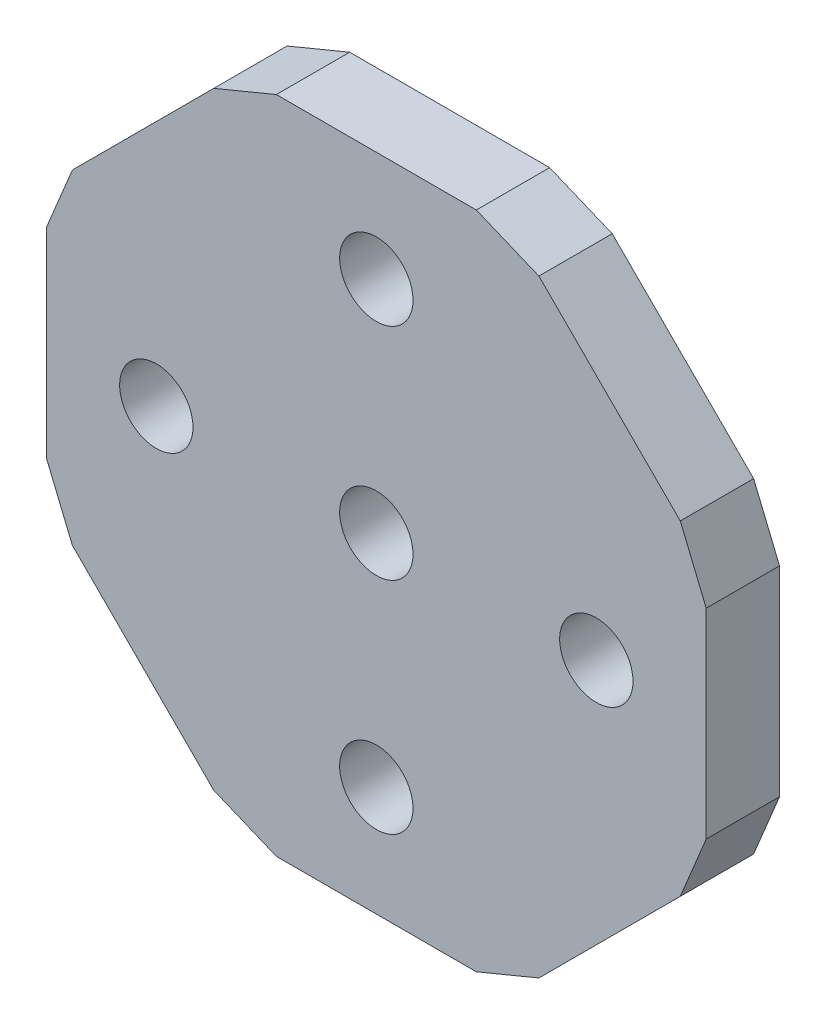
ISO-10303-21;
HEADER;
FILE_DESCRIPTION(('STEP AP214'),'2;1');
FILE_NAME('part.step','',(''),(''),'','','');
FILE_SCHEMA(('AUTOMOTIVE_DESIGN { 1 0 10303 214 1 1 1 1 }'));
ENDSEC;
DATA;
#1=APPLICATION_CONTEXT('core data for automotive mechanical design processes');
#2=APPLICATION_PROTOCOL_DEFINITION('international standard','automotive_design',2000,#1);
#3=PRODUCT_CONTEXT('',#1,'mechanical');
#4=PRODUCT('Part','Part','',(#3));
#5=PRODUCT_RELATED_PRODUCT_CATEGORY('part','',(#4));
#6=PRODUCT_DEFINITION_FORMATION('','',#4);
#7=PRODUCT_DEFINITION_CONTEXT('part definition',#1,'design');
#8=PRODUCT_DEFINITION('design','',#6,#7);
#9=PRODUCT_DEFINITION_SHAPE('','',#8);
#10=(LENGTH_UNIT() NAMED_UNIT(*) SI_UNIT(.MILLI.,.METRE.));
#11=(NAMED_UNIT(*) PLANE_ANGLE_UNIT() SI_UNIT($,.RADIAN.));
#12=(NAMED_UNIT(*) SI_UNIT($,.STERADIAN.) SOLID_ANGLE_UNIT());
#13=UNCERTAINTY_MEASURE_WITH_UNIT(LENGTH_MEASURE(1.E-05),#10,'distance_accuracy_value','');
#14=(GEOMETRIC_REPRESENTATION_CONTEXT(3) GLOBAL_UNCERTAINTY_ASSIGNED_CONTEXT((#13)) GLOBAL_UNIT_ASSIGNED_CONTEXT((#10,
#11,#12)) REPRESENTATION_CONTEXT('',''));
#15=CARTESIAN_POINT('',(0.,0.,0.));
#16=DIRECTION('',(0.,0.,1.));
#17=DIRECTION('',(1.,0.,0.));
#18=AXIS2_PLACEMENT_3D('',#15,#16,#17);
#19=CARTESIAN_POINT('',(0.,0.,3.));
#20=DIRECTION('',(0.,0.,1.));
#21=DIRECTION('',(1.,0.,0.));
#22=AXIS2_PLACEMENT_3D('',#19,#20,#21);
#23=PLANE('',#22);
#24=CARTESIAN_POINT('',(224.7478079135,241.9520199932,3.));
#25=DIRECTION('',(0.,0.,1.));
#26=DIRECTION('',(1.,0.,0.));
#27=AXIS2_PLACEMENT_3D('',#24,#25,#26);
#28=CIRCLE('',#27,1.5);
#29=CARTESIAN_POINT('',(226.2478079135,241.9520199932,3.));
#30=VERTEX_POINT('',#29);
#31=EDGE_CURVE('E348',#30,#30,#28,.T.);
#32=ORIENTED_EDGE('',*,*,#31,.F.);
#33=EDGE_LOOP('',(#32));
#34=FACE_BOUND('',#33,.T.);
#35=CARTESIAN_POINT('',(215.7478079135,232.9520199932,3.));
#36=DIRECTION('',(0.,0.,1.));
#37=DIRECTION('',(1.,0.,0.));
#38=AXIS2_PLACEMENT_3D('',#35,#36,#37);
#39=CIRCLE('',#38,1.5);
#40=CARTESIAN_POINT('',(217.2478079135,232.9520199932,3.));
#41=VERTEX_POINT('',#40);
#42=EDGE_CURVE('E360',#41,#41,#39,.T.);
#43=ORIENTED_EDGE('',*,*,#42,.F.);
#44=EDGE_LOOP('',(#43));
#45=FACE_BOUND('',#44,.T.);
#46=DIRECTION('',(0.923879532509778,0.382683432368732,0.));
#47=VECTOR('',#46,1.);
#48=CARTESIAN_POINT('',(222.3982801095,229.517680165,3.));
#49=LINE('',#48,#47);
#50=CARTESIAN_POINT('',(219.8376199377,228.4570199932,3.));
#51=VERTEX_POINT('',#50);
#52=CARTESIAN_POINT('',(222.3982801095,229.517680165,3.));
#53=VERTEX_POINT('',#52);
#54=EDGE_CURVE('E209',#51,#53,#49,.T.);
#55=ORIENTED_EDGE('',*,*,#54,.T.);
#56=DIRECTION('',(0.707106781186548,0.707106781186548,0.));
#57=VECTOR('',#56,1.);
#58=CARTESIAN_POINT('',(228.1821477417,235.3015477972,3.));
#59=LINE('',#58,#57);
#60=CARTESIAN_POINT('',(228.1821477417,235.3015477972,3.));
#61=VERTEX_POINT('',#60);
#62=EDGE_CURVE('E117',#53,#61,#59,.T.);
#63=ORIENTED_EDGE('',*,*,#62,.T.);
#64=DIRECTION('',(0.382683432368732,0.923879532509778,0.));
#65=VECTOR('',#64,1.);
#66=CARTESIAN_POINT('',(228.1821477417,235.3015477972,3.));
#67=LINE('',#66,#65);
#68=CARTESIAN_POINT('',(229.2428079135,237.862207969,3.));
#69=VERTEX_POINT('',#68);
#70=EDGE_CURVE('E248',#61,#69,#67,.T.);
#71=ORIENTED_EDGE('',*,*,#70,.T.);
#72=DIRECTION('',(0.,1.,0.));
#73=VECTOR('',#72,1.);
#74=CARTESIAN_POINT('',(229.2428079135,246.0418320174,3.));
#75=LINE('',#74,#73);
#76=CARTESIAN_POINT('',(229.2428079135,246.0418320174,3.));
#77=VERTEX_POINT('',#76);
#78=EDGE_CURVE('E267',#69,#77,#75,.T.);
#79=ORIENTED_EDGE('',*,*,#78,.T.);
#80=DIRECTION('',(-0.382683432368732,0.923879532509778,0.));
#81=VECTOR('',#80,1.);
#82=CARTESIAN_POINT('',(229.2428079135,246.0418320174,3.));
#83=LINE('',#82,#81);
#84=CARTESIAN_POINT('',(228.1821477417,248.6024921892,3.));
#85=VERTEX_POINT('',#84);
#86=EDGE_CURVE('E264',#77,#85,#83,.T.);
#87=ORIENTED_EDGE('',*,*,#86,.T.);
#88=DIRECTION('',(-0.707106781186548,0.707106781186548,0.));
#89=VECTOR('',#88,1.);
#90=CARTESIAN_POINT('',(222.3982801095,254.3863598214,3.));
#91=LINE('',#90,#89);
#92=CARTESIAN_POINT('',(222.3982801095,254.3863598214,3.));
#93=VERTEX_POINT('',#92);
#94=EDGE_CURVE('E266',#85,#93,#91,.T.);
#95=ORIENTED_EDGE('',*,*,#94,.T.);
#96=DIRECTION('',(-0.923879532509778,0.382683432368732,0.));
#97=VECTOR('',#96,1.);
#98=CARTESIAN_POINT('',(222.3982801095,254.3863598214,3.));
#99=LINE('',#98,#97);
#100=CARTESIAN_POINT('',(219.8376199377,255.4470199932,3.));
#101=VERTEX_POINT('',#100);
#102=EDGE_CURVE('E269',#93,#101,#99,.T.);
#103=ORIENTED_EDGE('',*,*,#102,.T.);
#104=DIRECTION('',(-1.,0.,0.));
#105=VECTOR('',#104,1.);
#106=CARTESIAN_POINT('',(211.6579958893,255.4470199932,3.));
#107=LINE('',#106,#105);
#108=CARTESIAN_POINT('',(211.6579958893,255.4470199932,3.));
#109=VERTEX_POINT('',#108);
#110=EDGE_CURVE('E275',#101,#109,#107,.T.);
#111=ORIENTED_EDGE('',*,*,#110,.T.);
#112=DIRECTION('',(-0.923879532509778,-0.382683432368732,0.));
#113=VECTOR('',#112,1.);
#114=CARTESIAN_POINT('',(211.6579958893,255.4470199932,3.));
#115=LINE('',#114,#113);
#116=CARTESIAN_POINT('',(209.0973357175,254.3863598214,3.));
#117=VERTEX_POINT('',#116);
#118=EDGE_CURVE('E277',#109,#117,#115,.T.);
#119=ORIENTED_EDGE('',*,*,#118,.T.);
#120=DIRECTION('',(-0.707106781186548,-0.707106781186548,0.));
#121=VECTOR('',#120,1.);
#122=CARTESIAN_POINT('',(203.3134680853,248.6024921892,3.));
#123=LINE('',#122,#121);
#124=CARTESIAN_POINT('',(203.3134680853,248.6024921892,3.));
#125=VERTEX_POINT('',#124);
#126=EDGE_CURVE('E279',#117,#125,#123,.T.);
#127=ORIENTED_EDGE('',*,*,#126,.T.);
#128=DIRECTION('',(-0.382683432368732,-0.923879532509778,0.));
#129=VECTOR('',#128,1.);
#130=CARTESIAN_POINT('',(202.2528079135,246.0418320174,3.));
#131=LINE('',#130,#129);
#132=CARTESIAN_POINT('',(202.2528079135,246.0418320174,3.));
#133=VERTEX_POINT('',#132);
#134=EDGE_CURVE('E281',#125,#133,#131,.T.);
#135=ORIENTED_EDGE('',*,*,#134,.T.);
#136=DIRECTION('',(0.,-1.,0.));
#137=VECTOR('',#136,1.);
#138=CARTESIAN_POINT('',(202.2528079135,237.862207969,3.));
#139=LINE('',#138,#137);
#140=CARTESIAN_POINT('',(202.2528079135,237.862207969,3.));
#141=VERTEX_POINT('',#140);
#142=EDGE_CURVE('E283',#133,#141,#139,.T.);
#143=ORIENTED_EDGE('',*,*,#142,.T.);
#144=DIRECTION('',(0.382683432368732,-0.923879532509778,0.));
#145=VECTOR('',#144,1.);
#146=CARTESIAN_POINT('',(202.2528079135,237.862207969,3.));
#147=LINE('',#146,#145);
#148=CARTESIAN_POINT('',(203.3134680853,235.3015477972,3.));
#149=VERTEX_POINT('',#148);
#150=EDGE_CURVE('E160',#141,#149,#147,.T.);
#151=ORIENTED_EDGE('',*,*,#150,.T.);
#152=DIRECTION('',(0.707106781186548,-0.707106781186548,0.));
#153=VECTOR('',#152,1.);
#154=CARTESIAN_POINT('',(209.0973357175,229.517680165,3.));
#155=LINE('',#154,#153);
#156=CARTESIAN_POINT('',(209.0973357175,229.517680165,3.));
#157=VERTEX_POINT('',#156);
#158=EDGE_CURVE('E154',#149,#157,#155,.T.);
#159=ORIENTED_EDGE('',*,*,#158,.T.);
#160=DIRECTION('',(0.923879532509778,-0.382683432368732,0.));
#161=VECTOR('',#160,1.);
#162=CARTESIAN_POINT('',(209.0973357175,229.517680165,3.));
#163=LINE('',#162,#161);
#164=CARTESIAN_POINT('',(211.6579958893,228.4570199932,3.));
#165=VERTEX_POINT('',#164);
#166=EDGE_CURVE('E158',#157,#165,#163,.T.);
#167=ORIENTED_EDGE('',*,*,#166,.T.);
#168=DIRECTION('',(1.,0.,0.));
#169=VECTOR('',#168,1.);
#170=CARTESIAN_POINT('',(219.8376199377,228.4570199932,3.));
#171=LINE('',#170,#169);
#172=EDGE_CURVE('E50',#165,#51,#171,.T.);
#173=ORIENTED_EDGE('',*,*,#172,.T.);
#174=EDGE_LOOP('',(#55,#63,#71,#79,#87,#95,#103,#111,#119,#127,#135,#143,#151,#159,#167,#173));
#175=FACE_BOUND('',#174,.T.);
#176=CARTESIAN_POINT('',(215.7478079135,241.9520199932,3.));
#177=DIRECTION('',(0.,0.,1.));
#178=DIRECTION('',(1.,0.,0.));
#179=AXIS2_PLACEMENT_3D('',#176,#177,#178);
#180=CIRCLE('',#179,1.5);
#181=CARTESIAN_POINT('',(217.2478079135,241.9520199932,3.));
#182=VERTEX_POINT('',#181);
#183=EDGE_CURVE('E182',#182,#182,#180,.T.);
#184=ORIENTED_EDGE('',*,*,#183,.F.);
#185=EDGE_LOOP('',(#184));
#186=FACE_BOUND('',#185,.T.);
#187=CARTESIAN_POINT('',(215.7478079135,250.9520199932,3.));
#188=DIRECTION('',(0.,0.,1.));
#189=DIRECTION('',(1.,0.,0.));
#190=AXIS2_PLACEMENT_3D('',#187,#188,#189);
#191=CIRCLE('',#190,1.5);
#192=CARTESIAN_POINT('',(217.2478079135,250.9520199932,3.));
#193=VERTEX_POINT('',#192);
#194=EDGE_CURVE('E354',#193,#193,#191,.T.);
#195=ORIENTED_EDGE('',*,*,#194,.F.);
#196=EDGE_LOOP('',(#195));
#197=FACE_BOUND('',#196,.T.);
#198=CARTESIAN_POINT('',(206.7478079135,241.9520199932,3.));
#199=DIRECTION('',(0.,0.,1.));
#200=DIRECTION('',(1.,0.,0.));
#201=AXIS2_PLACEMENT_3D('',#198,#199,#200);
#202=CIRCLE('',#201,1.5);
#203=CARTESIAN_POINT('',(208.2478079135,241.9520199932,3.));
#204=VERTEX_POINT('',#203);
#205=EDGE_CURVE('E339',#204,#204,#202,.T.);
#206=ORIENTED_EDGE('',*,*,#205,.F.);
#207=EDGE_LOOP('',(#206));
#208=FACE_BOUND('',#207,.T.);
#209=ADVANCED_FACE('F33',(#34,#45,#175,#186,#197,#208),#23,.T.);
#210=CARTESIAN_POINT('',(0.,0.,0.));
#211=DIRECTION('',(0.,0.,1.));
#212=DIRECTION('',(1.,0.,0.));
#213=AXIS2_PLACEMENT_3D('',#210,#211,#212);
#214=PLANE('',#213);
#215=CARTESIAN_POINT('',(224.7478079135,241.9520199932,0.));
#216=DIRECTION('',(0.,0.,1.));
#217=DIRECTION('',(1.,0.,0.));
#218=AXIS2_PLACEMENT_3D('',#215,#216,#217);
#219=CIRCLE('',#218,1.5);
#220=CARTESIAN_POINT('',(226.2478079135,241.9520199932,0.));
#221=VERTEX_POINT('',#220);
#222=EDGE_CURVE('E345',#221,#221,#219,.T.);
#223=ORIENTED_EDGE('',*,*,#222,.T.);
#224=EDGE_LOOP('',(#223));
#225=FACE_BOUND('',#224,.T.);
#226=CARTESIAN_POINT('',(215.7478079135,232.9520199932,0.));
#227=DIRECTION('',(0.,0.,1.));
#228=DIRECTION('',(1.,0.,0.));
#229=AXIS2_PLACEMENT_3D('',#226,#227,#228);
#230=CIRCLE('',#229,1.5);
#231=CARTESIAN_POINT('',(217.2478079135,232.9520199932,0.));
#232=VERTEX_POINT('',#231);
#233=EDGE_CURVE('E357',#232,#232,#230,.T.);
#234=ORIENTED_EDGE('',*,*,#233,.T.);
#235=EDGE_LOOP('',(#234));
#236=FACE_BOUND('',#235,.T.);
#237=DIRECTION('',(0.923879532509778,0.382683432368732,0.));
#238=VECTOR('',#237,1.);
#239=CARTESIAN_POINT('',(222.3982801095,229.517680165,0.));
#240=LINE('',#239,#238);
#241=CARTESIAN_POINT('',(219.8376199377,228.4570199932,0.));
#242=VERTEX_POINT('',#241);
#243=CARTESIAN_POINT('',(222.3982801095,229.517680165,0.));
#244=VERTEX_POINT('',#243);
#245=EDGE_CURVE('E178',#242,#244,#240,.T.);
#246=ORIENTED_EDGE('',*,*,#245,.F.);
#247=DIRECTION('',(1.,0.,0.));
#248=VECTOR('',#247,1.);
#249=CARTESIAN_POINT('',(219.8376199377,228.4570199932,0.));
#250=LINE('',#249,#248);
#251=CARTESIAN_POINT('',(211.6579958893,228.4570199932,0.));
#252=VERTEX_POINT('',#251);
#253=EDGE_CURVE('E109',#252,#242,#250,.T.);
#254=ORIENTED_EDGE('',*,*,#253,.F.);
#255=DIRECTION('',(0.923879532509778,-0.382683432368732,0.));
#256=VECTOR('',#255,1.);
#257=CARTESIAN_POINT('',(209.0973357175,229.517680165,0.));
#258=LINE('',#257,#256);
#259=CARTESIAN_POINT('',(209.0973357175,229.517680165,0.));
#260=VERTEX_POINT('',#259);
#261=EDGE_CURVE('E103',#260,#252,#258,.T.);
#262=ORIENTED_EDGE('',*,*,#261,.F.);
#263=DIRECTION('',(0.707106781186548,-0.707106781186548,0.));
#264=VECTOR('',#263,1.);
#265=CARTESIAN_POINT('',(209.0973357175,229.517680165,0.));
#266=LINE('',#265,#264);
#267=CARTESIAN_POINT('',(203.3134680853,235.3015477972,0.));
#268=VERTEX_POINT('',#267);
#269=EDGE_CURVE('E168',#268,#260,#266,.T.);
#270=ORIENTED_EDGE('',*,*,#269,.F.);
#271=DIRECTION('',(0.382683432368732,-0.923879532509778,0.));
#272=VECTOR('',#271,1.);
#273=CARTESIAN_POINT('',(202.2528079135,237.862207969,0.));
#274=LINE('',#273,#272);
#275=CARTESIAN_POINT('',(202.2528079135,237.862207969,0.));
#276=VERTEX_POINT('',#275);
#277=EDGE_CURVE('E204',#276,#268,#274,.T.);
#278=ORIENTED_EDGE('',*,*,#277,.F.);
#279=DIRECTION('',(0.,-1.,0.));
#280=VECTOR('',#279,1.);
#281=CARTESIAN_POINT('',(202.2528079135,237.862207969,0.));
#282=LINE('',#281,#280);
#283=CARTESIAN_POINT('',(202.2528079135,246.0418320174,0.));
#284=VERTEX_POINT('',#283);
#285=EDGE_CURVE('E202',#284,#276,#282,.T.);
#286=ORIENTED_EDGE('',*,*,#285,.F.);
#287=DIRECTION('',(-0.382683432368732,-0.923879532509778,0.));
#288=VECTOR('',#287,1.);
#289=CARTESIAN_POINT('',(202.2528079135,246.0418320174,0.));
#290=LINE('',#289,#288);
#291=CARTESIAN_POINT('',(203.3134680853,248.6024921892,0.));
#292=VERTEX_POINT('',#291);
#293=EDGE_CURVE('E200',#292,#284,#290,.T.);
#294=ORIENTED_EDGE('',*,*,#293,.F.);
#295=DIRECTION('',(-0.707106781186548,-0.707106781186548,0.));
#296=VECTOR('',#295,1.);
#297=CARTESIAN_POINT('',(203.3134680853,248.6024921892,0.));
#298=LINE('',#297,#296);
#299=CARTESIAN_POINT('',(209.0973357175,254.3863598214,0.));
#300=VERTEX_POINT('',#299);
#301=EDGE_CURVE('E198',#300,#292,#298,.T.);
#302=ORIENTED_EDGE('',*,*,#301,.F.);
#303=DIRECTION('',(-0.923879532509778,-0.382683432368732,0.));
#304=VECTOR('',#303,1.);
#305=CARTESIAN_POINT('',(211.6579958893,255.4470199932,0.));
#306=LINE('',#305,#304);
#307=CARTESIAN_POINT('',(211.6579958893,255.4470199932,0.));
#308=VERTEX_POINT('',#307);
#309=EDGE_CURVE('E196',#308,#300,#306,.T.);
#310=ORIENTED_EDGE('',*,*,#309,.F.);
#311=DIRECTION('',(-1.,0.,0.));
#312=VECTOR('',#311,1.);
#313=CARTESIAN_POINT('',(211.6579958893,255.4470199932,0.));
#314=LINE('',#313,#312);
#315=CARTESIAN_POINT('',(219.8376199377,255.4470199932,0.));
#316=VERTEX_POINT('',#315);
#317=EDGE_CURVE('E194',#316,#308,#314,.T.);
#318=ORIENTED_EDGE('',*,*,#317,.F.);
#319=DIRECTION('',(-0.923879532509778,0.382683432368732,0.));
#320=VECTOR('',#319,1.);
#321=CARTESIAN_POINT('',(222.3982801095,254.3863598214,0.));
#322=LINE('',#321,#320);
#323=CARTESIAN_POINT('',(222.3982801095,254.3863598214,0.));
#324=VERTEX_POINT('',#323);
#325=EDGE_CURVE('E192',#324,#316,#322,.T.);
#326=ORIENTED_EDGE('',*,*,#325,.F.);
#327=DIRECTION('',(-0.707106781186548,0.707106781186548,0.));
#328=VECTOR('',#327,1.);
#329=CARTESIAN_POINT('',(222.3982801095,254.3863598214,0.));
#330=LINE('',#329,#328);
#331=CARTESIAN_POINT('',(228.1821477417,248.6024921892,0.));
#332=VERTEX_POINT('',#331);
#333=EDGE_CURVE('E190',#332,#324,#330,.T.);
#334=ORIENTED_EDGE('',*,*,#333,.F.);
#335=DIRECTION('',(-0.382683432368732,0.923879532509778,0.));
#336=VECTOR('',#335,1.);
#337=CARTESIAN_POINT('',(229.2428079135,246.0418320174,0.));
#338=LINE('',#337,#336);
#339=CARTESIAN_POINT('',(229.2428079135,246.0418320174,0.));
#340=VERTEX_POINT('',#339);
#341=EDGE_CURVE('E188',#340,#332,#338,.T.);
#342=ORIENTED_EDGE('',*,*,#341,.F.);
#343=DIRECTION('',(0.,1.,0.));
#344=VECTOR('',#343,1.);
#345=CARTESIAN_POINT('',(229.2428079135,246.0418320174,0.));
#346=LINE('',#345,#344);
#347=CARTESIAN_POINT('',(229.2428079135,237.862207969,0.));
#348=VERTEX_POINT('',#347);
#349=EDGE_CURVE('E186',#348,#340,#346,.T.);
#350=ORIENTED_EDGE('',*,*,#349,.F.);
#351=DIRECTION('',(0.382683432368732,0.923879532509778,0.));
#352=VECTOR('',#351,1.);
#353=CARTESIAN_POINT('',(228.1821477417,235.3015477972,0.));
#354=LINE('',#353,#352);
#355=CARTESIAN_POINT('',(228.1821477417,235.3015477972,0.));
#356=VERTEX_POINT('',#355);
#357=EDGE_CURVE('E184',#356,#348,#354,.T.);
#358=ORIENTED_EDGE('',*,*,#357,.F.);
#359=DIRECTION('',(0.707106781186548,0.707106781186548,0.));
#360=VECTOR('',#359,1.);
#361=CARTESIAN_POINT('',(228.1821477417,235.3015477972,0.));
#362=LINE('',#361,#360);
#363=EDGE_CURVE('E181',#244,#356,#362,.T.);
#364=ORIENTED_EDGE('',*,*,#363,.F.);
#365=EDGE_LOOP('',(#246,#254,#262,#270,#278,#286,#294,#302,#310,#318,#326,#334,#342,#350,#358,#364));
#366=FACE_BOUND('',#365,.T.);
#367=CARTESIAN_POINT('',(215.7478079135,241.9520199932,0.));
#368=DIRECTION('',(0.,0.,1.));
#369=DIRECTION('',(1.,0.,0.));
#370=AXIS2_PLACEMENT_3D('',#367,#368,#369);
#371=CIRCLE('',#370,1.5);
#372=CARTESIAN_POINT('',(217.2478079135,241.9520199932,0.));
#373=VERTEX_POINT('',#372);
#374=EDGE_CURVE('E363',#373,#373,#371,.T.);
#375=ORIENTED_EDGE('',*,*,#374,.T.);
#376=EDGE_LOOP('',(#375));
#377=FACE_BOUND('',#376,.T.);
#378=CARTESIAN_POINT('',(215.7478079135,250.9520199932,0.));
#379=DIRECTION('',(0.,0.,1.));
#380=DIRECTION('',(1.,0.,0.));
#381=AXIS2_PLACEMENT_3D('',#378,#379,#380);
#382=CIRCLE('',#381,1.5);
#383=CARTESIAN_POINT('',(217.2478079135,250.9520199932,0.));
#384=VERTEX_POINT('',#383);
#385=EDGE_CURVE('E351',#384,#384,#382,.T.);
#386=ORIENTED_EDGE('',*,*,#385,.T.);
#387=EDGE_LOOP('',(#386));
#388=FACE_BOUND('',#387,.T.);
#389=CARTESIAN_POINT('',(206.7478079135,241.9520199932,0.));
#390=DIRECTION('',(0.,0.,1.));
#391=DIRECTION('',(1.,0.,0.));
#392=AXIS2_PLACEMENT_3D('',#389,#390,#391);
#393=CIRCLE('',#392,1.5);
#394=CARTESIAN_POINT('',(208.2478079135,241.9520199932,0.));
#395=VERTEX_POINT('',#394);
#396=EDGE_CURVE('E342',#395,#395,#393,.T.);
#397=ORIENTED_EDGE('',*,*,#396,.T.);
#398=EDGE_LOOP('',(#397));
#399=FACE_BOUND('',#398,.T.);
#400=ADVANCED_FACE('F252',(#225,#236,#366,#377,#388,#399),#214,.F.);
#401=CARTESIAN_POINT('',(222.3982801095,229.517680165,3.));
#402=DIRECTION('',(-0.382683432368732,0.923879532509778,0.));
#403=DIRECTION('',(-0.923879532509778,-0.382683432368732,0.));
#404=AXIS2_PLACEMENT_3D('',#401,#402,#403);
#405=PLANE('',#404);
#406=ORIENTED_EDGE('',*,*,#245,.T.);
#407=DIRECTION('',(0.,0.,-1.));
#408=VECTOR('',#407,1.);
#409=CARTESIAN_POINT('',(222.3982801095,229.517680165,3.));
#410=LINE('',#409,#408);
#411=EDGE_CURVE('E11',#53,#244,#410,.T.);
#412=ORIENTED_EDGE('',*,*,#411,.F.);
#413=ORIENTED_EDGE('',*,*,#54,.F.);
#414=DIRECTION('',(0.,0.,-1.));
#415=VECTOR('',#414,1.);
#416=CARTESIAN_POINT('',(219.8376199377,228.4570199932,3.));
#417=LINE('',#416,#415);
#418=EDGE_CURVE('E174',#51,#242,#417,.T.);
#419=ORIENTED_EDGE('',*,*,#418,.T.);
#420=EDGE_LOOP('',(#406,#412,#413,#419));
#421=FACE_BOUND('',#420,.T.);
#422=ADVANCED_FACE('F35',(#421),#405,.F.);
#423=CARTESIAN_POINT('',(228.1821477417,235.3015477972,3.));
#424=DIRECTION('',(-0.707106781186547,0.707106781186547,0.));
#425=DIRECTION('',(-0.707106781186548,-0.707106781186548,0.));
#426=AXIS2_PLACEMENT_3D('',#423,#424,#425);
#427=PLANE('',#426);
#428=ORIENTED_EDGE('',*,*,#363,.T.);
#429=DIRECTION('',(0.,0.,-1.));
#430=VECTOR('',#429,1.);
#431=CARTESIAN_POINT('',(228.1821477417,235.3015477972,3.));
#432=LINE('',#431,#430);
#433=EDGE_CURVE('E42',#61,#356,#432,.T.);
#434=ORIENTED_EDGE('',*,*,#433,.F.);
#435=ORIENTED_EDGE('',*,*,#62,.F.);
#436=ORIENTED_EDGE('',*,*,#411,.T.);
#437=EDGE_LOOP('',(#428,#434,#435,#436));
#438=FACE_BOUND('',#437,.T.);
#439=ADVANCED_FACE('F521',(#438),#427,.F.);
#440=CARTESIAN_POINT('',(228.1821477417,235.3015477972,3.));
#441=DIRECTION('',(-0.923879532509778,0.382683432368732,0.));
#442=DIRECTION('',(-0.382683432368732,-0.923879532509778,0.));
#443=AXIS2_PLACEMENT_3D('',#440,#441,#442);
#444=PLANE('',#443);
#445=ORIENTED_EDGE('',*,*,#357,.T.);
#446=DIRECTION('',(0.,0.,-1.));
#447=VECTOR('',#446,1.);
#448=CARTESIAN_POINT('',(229.2428079135,237.862207969,3.));
#449=LINE('',#448,#447);
#450=EDGE_CURVE('E240',#69,#348,#449,.T.);
#451=ORIENTED_EDGE('',*,*,#450,.F.);
#452=ORIENTED_EDGE('',*,*,#70,.F.);
#453=ORIENTED_EDGE('',*,*,#433,.T.);
#454=EDGE_LOOP('',(#445,#451,#452,#453));
#455=FACE_BOUND('',#454,.T.);
#456=ADVANCED_FACE('F246',(#455),#444,.F.);
#457=CARTESIAN_POINT('',(229.2428079135,246.0418320174,3.));
#458=DIRECTION('',(-1.,0.,0.));
#459=DIRECTION('',(0.,0.,1.));
#460=AXIS2_PLACEMENT_3D('',#457,#458,#459);
#461=PLANE('',#460);
#462=ORIENTED_EDGE('',*,*,#349,.T.);
#463=DIRECTION('',(0.,0.,-1.));
#464=VECTOR('',#463,1.);
#465=CARTESIAN_POINT('',(229.2428079135,246.0418320174,3.));
#466=LINE('',#465,#464);
#467=EDGE_CURVE('E237',#77,#340,#466,.T.);
#468=ORIENTED_EDGE('',*,*,#467,.F.);
#469=ORIENTED_EDGE('',*,*,#78,.F.);
#470=ORIENTED_EDGE('',*,*,#450,.T.);
#471=EDGE_LOOP('',(#462,#468,#469,#470));
#472=FACE_BOUND('',#471,.T.);
#473=ADVANCED_FACE('F258',(#472),#461,.F.);
#474=CARTESIAN_POINT('',(229.2428079135,246.0418320174,3.));
#475=DIRECTION('',(-0.923879532509778,-0.382683432368732,0.));
#476=DIRECTION('',(0.382683432368732,-0.923879532509778,0.));
#477=AXIS2_PLACEMENT_3D('',#474,#475,#476);
#478=PLANE('',#477);
#479=ORIENTED_EDGE('',*,*,#341,.T.);
#480=DIRECTION('',(0.,0.,-1.));
#481=VECTOR('',#480,1.);
#482=CARTESIAN_POINT('',(228.1821477417,248.6024921892,3.));
#483=LINE('',#482,#481);
#484=EDGE_CURVE('E234',#85,#332,#483,.T.);
#485=ORIENTED_EDGE('',*,*,#484,.F.);
#486=ORIENTED_EDGE('',*,*,#86,.F.);
#487=ORIENTED_EDGE('',*,*,#467,.T.);
#488=EDGE_LOOP('',(#479,#485,#486,#487));
#489=FACE_BOUND('',#488,.T.);
#490=ADVANCED_FACE('F262',(#489),#478,.F.);
#491=CARTESIAN_POINT('',(222.3982801095,254.3863598214,3.));
#492=DIRECTION('',(-0.707106781186547,-0.707106781186547,0.));
#493=DIRECTION('',(0.707106781186548,-0.707106781186548,0.));
#494=AXIS2_PLACEMENT_3D('',#491,#492,#493);
#495=PLANE('',#494);
#496=ORIENTED_EDGE('',*,*,#333,.T.);
#497=DIRECTION('',(0.,0.,-1.));
#498=VECTOR('',#497,1.);
#499=CARTESIAN_POINT('',(222.3982801095,254.3863598214,3.));
#500=LINE('',#499,#498);
#501=EDGE_CURVE('E231',#93,#324,#500,.T.);
#502=ORIENTED_EDGE('',*,*,#501,.F.);
#503=ORIENTED_EDGE('',*,*,#94,.F.);
#504=ORIENTED_EDGE('',*,*,#484,.T.);
#505=EDGE_LOOP('',(#496,#502,#503,#504));
#506=FACE_BOUND('',#505,.T.);
#507=ADVANCED_FACE('F486',(#506),#495,.F.);
#508=CARTESIAN_POINT('',(222.3982801095,254.3863598214,3.));
#509=DIRECTION('',(-0.382683432368732,-0.923879532509778,0.));
#510=DIRECTION('',(0.923879532509778,-0.382683432368732,0.));
#511=AXIS2_PLACEMENT_3D('',#508,#509,#510);
#512=PLANE('',#511);
#513=ORIENTED_EDGE('',*,*,#325,.T.);
#514=DIRECTION('',(0.,0.,-1.));
#515=VECTOR('',#514,1.);
#516=CARTESIAN_POINT('',(219.8376199377,255.4470199932,3.));
#517=LINE('',#516,#515);
#518=EDGE_CURVE('E228',#101,#316,#517,.T.);
#519=ORIENTED_EDGE('',*,*,#518,.F.);
#520=ORIENTED_EDGE('',*,*,#102,.F.);
#521=ORIENTED_EDGE('',*,*,#501,.T.);
#522=EDGE_LOOP('',(#513,#519,#520,#521));
#523=FACE_BOUND('',#522,.T.);
#524=ADVANCED_FACE('F476',(#523),#512,.F.);
#525=CARTESIAN_POINT('',(211.6579958893,255.4470199932,3.));
#526=DIRECTION('',(0.,-1.,0.));
#527=DIRECTION('',(0.,0.,-1.));
#528=AXIS2_PLACEMENT_3D('',#525,#526,#527);
#529=PLANE('',#528);
#530=ORIENTED_EDGE('',*,*,#317,.T.);
#531=DIRECTION('',(0.,0.,-1.));
#532=VECTOR('',#531,1.);
#533=CARTESIAN_POINT('',(211.6579958893,255.4470199932,3.));
#534=LINE('',#533,#532);
#535=EDGE_CURVE('E225',#109,#308,#534,.T.);
#536=ORIENTED_EDGE('',*,*,#535,.F.);
#537=ORIENTED_EDGE('',*,*,#110,.F.);
#538=ORIENTED_EDGE('',*,*,#518,.T.);
#539=EDGE_LOOP('',(#530,#536,#537,#538));
#540=FACE_BOUND('',#539,.T.);
#541=ADVANCED_FACE('F466',(#540),#529,.F.);
#542=CARTESIAN_POINT('',(211.6579958893,255.4470199932,3.));
#543=DIRECTION('',(0.382683432368732,-0.923879532509778,0.));
#544=DIRECTION('',(0.923879532509778,0.382683432368732,0.));
#545=AXIS2_PLACEMENT_3D('',#542,#543,#544);
#546=PLANE('',#545);
#547=ORIENTED_EDGE('',*,*,#309,.T.);
#548=DIRECTION('',(0.,0.,-1.));
#549=VECTOR('',#548,1.);
#550=CARTESIAN_POINT('',(209.0973357175,254.3863598214,3.));
#551=LINE('',#550,#549);
#552=EDGE_CURVE('E222',#117,#300,#551,.T.);
#553=ORIENTED_EDGE('',*,*,#552,.F.);
#554=ORIENTED_EDGE('',*,*,#118,.F.);
#555=ORIENTED_EDGE('',*,*,#535,.T.);
#556=EDGE_LOOP('',(#547,#553,#554,#555));
#557=FACE_BOUND('',#556,.T.);
#558=ADVANCED_FACE('F456',(#557),#546,.F.);
#559=CARTESIAN_POINT('',(203.3134680853,248.6024921892,3.));
#560=DIRECTION('',(0.707106781186547,-0.707106781186547,0.));
#561=DIRECTION('',(0.707106781186548,0.707106781186548,0.));
#562=AXIS2_PLACEMENT_3D('',#559,#560,#561);
#563=PLANE('',#562);
#564=ORIENTED_EDGE('',*,*,#301,.T.);
#565=DIRECTION('',(0.,0.,-1.));
#566=VECTOR('',#565,1.);
#567=CARTESIAN_POINT('',(203.3134680853,248.6024921892,3.));
#568=LINE('',#567,#566);
#569=EDGE_CURVE('E219',#125,#292,#568,.T.);
#570=ORIENTED_EDGE('',*,*,#569,.F.);
#571=ORIENTED_EDGE('',*,*,#126,.F.);
#572=ORIENTED_EDGE('',*,*,#552,.T.);
#573=EDGE_LOOP('',(#564,#570,#571,#572));
#574=FACE_BOUND('',#573,.T.);
#575=ADVANCED_FACE('F446',(#574),#563,.F.);
#576=CARTESIAN_POINT('',(202.2528079135,246.0418320174,3.));
#577=DIRECTION('',(0.923879532509778,-0.382683432368732,0.));
#578=DIRECTION('',(0.382683432368732,0.923879532509778,0.));
#579=AXIS2_PLACEMENT_3D('',#576,#577,#578);
#580=PLANE('',#579);
#581=ORIENTED_EDGE('',*,*,#293,.T.);
#582=DIRECTION('',(0.,0.,-1.));
#583=VECTOR('',#582,1.);
#584=CARTESIAN_POINT('',(202.2528079135,246.0418320174,3.));
#585=LINE('',#584,#583);
#586=EDGE_CURVE('E216',#133,#284,#585,.T.);
#587=ORIENTED_EDGE('',*,*,#586,.F.);
#588=ORIENTED_EDGE('',*,*,#134,.F.);
#589=ORIENTED_EDGE('',*,*,#569,.T.);
#590=EDGE_LOOP('',(#581,#587,#588,#589));
#591=FACE_BOUND('',#590,.T.);
#592=ADVANCED_FACE('F437',(#591),#580,.F.);
#593=CARTESIAN_POINT('',(202.2528079135,237.862207969,3.));
#594=DIRECTION('',(1.,0.,0.));
#595=DIRECTION('',(0.,0.,-1.));
#596=AXIS2_PLACEMENT_3D('',#593,#594,#595);
#597=PLANE('',#596);
#598=ORIENTED_EDGE('',*,*,#285,.T.);
#599=DIRECTION('',(0.,0.,-1.));
#600=VECTOR('',#599,1.);
#601=CARTESIAN_POINT('',(202.2528079135,237.862207969,3.));
#602=LINE('',#601,#600);
#603=EDGE_CURVE('E213',#141,#276,#602,.T.);
#604=ORIENTED_EDGE('',*,*,#603,.F.);
#605=ORIENTED_EDGE('',*,*,#142,.F.);
#606=ORIENTED_EDGE('',*,*,#586,.T.);
#607=EDGE_LOOP('',(#598,#604,#605,#606));
#608=FACE_BOUND('',#607,.T.);
#609=ADVANCED_FACE('F289',(#608),#597,.F.);
#610=CARTESIAN_POINT('',(202.2528079135,237.862207969,3.));
#611=DIRECTION('',(0.923879532509778,0.382683432368732,0.));
#612=DIRECTION('',(-0.382683432368732,0.923879532509778,0.));
#613=AXIS2_PLACEMENT_3D('',#610,#611,#612);
#614=PLANE('',#613);
#615=ORIENTED_EDGE('',*,*,#277,.T.);
#616=DIRECTION('',(0.,0.,-1.));
#617=VECTOR('',#616,1.);
#618=CARTESIAN_POINT('',(203.3134680853,235.3015477972,3.));
#619=LINE('',#618,#617);
#620=EDGE_CURVE('E169',#149,#268,#619,.T.);
#621=ORIENTED_EDGE('',*,*,#620,.F.);
#622=ORIENTED_EDGE('',*,*,#150,.F.);
#623=ORIENTED_EDGE('',*,*,#603,.T.);
#624=EDGE_LOOP('',(#615,#621,#622,#623));
#625=FACE_BOUND('',#624,.T.);
#626=ADVANCED_FACE('F293',(#625),#614,.F.);
#627=CARTESIAN_POINT('',(209.0973357175,229.517680165,3.));
#628=DIRECTION('',(0.707106781186547,0.707106781186547,0.));
#629=DIRECTION('',(-0.707106781186548,0.707106781186548,0.));
#630=AXIS2_PLACEMENT_3D('',#627,#628,#629);
#631=PLANE('',#630);
#632=ORIENTED_EDGE('',*,*,#269,.T.);
#633=DIRECTION('',(0.,0.,-1.));
#634=VECTOR('',#633,1.);
#635=CARTESIAN_POINT('',(209.0973357175,229.517680165,3.));
#636=LINE('',#635,#634);
#637=EDGE_CURVE('E165',#157,#260,#636,.T.);
#638=ORIENTED_EDGE('',*,*,#637,.F.);
#639=ORIENTED_EDGE('',*,*,#158,.F.);
#640=ORIENTED_EDGE('',*,*,#620,.T.);
#641=EDGE_LOOP('',(#632,#638,#639,#640));
#642=FACE_BOUND('',#641,.T.);
#643=ADVANCED_FACE('F166',(#642),#631,.F.);
#644=CARTESIAN_POINT('',(209.0973357175,229.517680165,3.));
#645=DIRECTION('',(0.382683432368732,0.923879532509778,0.));
#646=DIRECTION('',(-0.923879532509778,0.382683432368732,0.));
#647=AXIS2_PLACEMENT_3D('',#644,#645,#646);
#648=PLANE('',#647);
#649=ORIENTED_EDGE('',*,*,#261,.T.);
#650=DIRECTION('',(0.,0.,-1.));
#651=VECTOR('',#650,1.);
#652=CARTESIAN_POINT('',(211.6579958893,228.4570199932,3.));
#653=LINE('',#652,#651);
#654=EDGE_CURVE('E170',#165,#252,#653,.T.);
#655=ORIENTED_EDGE('',*,*,#654,.F.);
#656=ORIENTED_EDGE('',*,*,#166,.F.);
#657=ORIENTED_EDGE('',*,*,#637,.T.);
#658=EDGE_LOOP('',(#649,#655,#656,#657));
#659=FACE_BOUND('',#658,.T.);
#660=ADVANCED_FACE('F172',(#659),#648,.F.);
#661=CARTESIAN_POINT('',(219.8376199377,228.4570199932,3.));
#662=DIRECTION('',(0.,1.,0.));
#663=DIRECTION('',(0.,0.,1.));
#664=AXIS2_PLACEMENT_3D('',#661,#662,#663);
#665=PLANE('',#664);
#666=ORIENTED_EDGE('',*,*,#253,.T.);
#667=ORIENTED_EDGE('',*,*,#418,.F.);
#668=ORIENTED_EDGE('',*,*,#172,.F.);
#669=ORIENTED_EDGE('',*,*,#654,.T.);
#670=EDGE_LOOP('',(#666,#667,#668,#669));
#671=FACE_BOUND('',#670,.T.);
#672=ADVANCED_FACE('F297',(#671),#665,.F.);
#673=CARTESIAN_POINT('',(215.7478079135,241.9520199932,3.));
#674=DIRECTION('',(0.,0.,-1.));
#675=DIRECTION('',(-1.,0.,0.));
#676=AXIS2_PLACEMENT_3D('',#673,#674,#675);
#677=CYLINDRICAL_SURFACE('',#676,1.5);
#678=ORIENTED_EDGE('',*,*,#183,.T.);
#679=EDGE_LOOP('',(#678));
#680=FACE_BOUND('',#679,.T.);
#681=ORIENTED_EDGE('',*,*,#374,.F.);
#682=EDGE_LOOP('',(#681));
#683=FACE_BOUND('',#682,.T.);
#684=ADVANCED_FACE('F299',(#680,#683),#677,.F.);
#685=CARTESIAN_POINT('',(215.7478079135,232.9520199932,3.));
#686=DIRECTION('',(0.,0.,-1.));
#687=DIRECTION('',(-1.,0.,0.));
#688=AXIS2_PLACEMENT_3D('',#685,#686,#687);
#689=CYLINDRICAL_SURFACE('',#688,1.5);
#690=ORIENTED_EDGE('',*,*,#42,.T.);
#691=EDGE_LOOP('',(#690));
#692=FACE_BOUND('',#691,.T.);
#693=ORIENTED_EDGE('',*,*,#233,.F.);
#694=EDGE_LOOP('',(#693));
#695=FACE_BOUND('',#694,.T.);
#696=ADVANCED_FACE('F305',(#692,#695),#689,.F.);
#697=CARTESIAN_POINT('',(215.7478079135,250.9520199932,3.));
#698=DIRECTION('',(0.,0.,-1.));
#699=DIRECTION('',(-1.,0.,0.));
#700=AXIS2_PLACEMENT_3D('',#697,#698,#699);
#701=CYLINDRICAL_SURFACE('',#700,1.5);
#702=ORIENTED_EDGE('',*,*,#194,.T.);
#703=EDGE_LOOP('',(#702));
#704=FACE_BOUND('',#703,.T.);
#705=ORIENTED_EDGE('',*,*,#385,.F.);
#706=EDGE_LOOP('',(#705));
#707=FACE_BOUND('',#706,.T.);
#708=ADVANCED_FACE('F322',(#704,#707),#701,.F.);
#709=CARTESIAN_POINT('',(224.7478079135,241.9520199932,3.));
#710=DIRECTION('',(0.,0.,-1.));
#711=DIRECTION('',(-1.,0.,0.));
#712=AXIS2_PLACEMENT_3D('',#709,#710,#711);
#713=CYLINDRICAL_SURFACE('',#712,1.5);
#714=ORIENTED_EDGE('',*,*,#31,.T.);
#715=EDGE_LOOP('',(#714));
#716=FACE_BOUND('',#715,.T.);
#717=ORIENTED_EDGE('',*,*,#222,.F.);
#718=EDGE_LOOP('',(#717));
#719=FACE_BOUND('',#718,.T.);
#720=ADVANCED_FACE('F326',(#716,#719),#713,.F.);
#721=CARTESIAN_POINT('',(206.7478079135,241.9520199932,3.));
#722=DIRECTION('',(0.,0.,-1.));
#723=DIRECTION('',(-1.,0.,0.));
#724=AXIS2_PLACEMENT_3D('',#721,#722,#723);
#725=CYLINDRICAL_SURFACE('',#724,1.5);
#726=ORIENTED_EDGE('',*,*,#205,.T.);
#727=EDGE_LOOP('',(#726));
#728=FACE_BOUND('',#727,.T.);
#729=ORIENTED_EDGE('',*,*,#396,.F.);
#730=EDGE_LOOP('',(#729));
#731=FACE_BOUND('',#730,.T.);
#732=ADVANCED_FACE('F330',(#728,#731),#725,.F.);
#733=CLOSED_SHELL('',(#209,#400,#422,#439,#456,#473,#490,#507,#524,#541,#558,#575,#592,#609,
#626,#643,#660,#672,#684,#696,#708,#720,#732));
#734=MANIFOLD_SOLID_BREP('B2',#733);
#735=ADVANCED_BREP_SHAPE_REPRESENTATION('',(#18,#734),#14);
#736=SHAPE_DEFINITION_REPRESENTATION(#9,#735);
ENDSEC;
END-ISO-10303-21;
